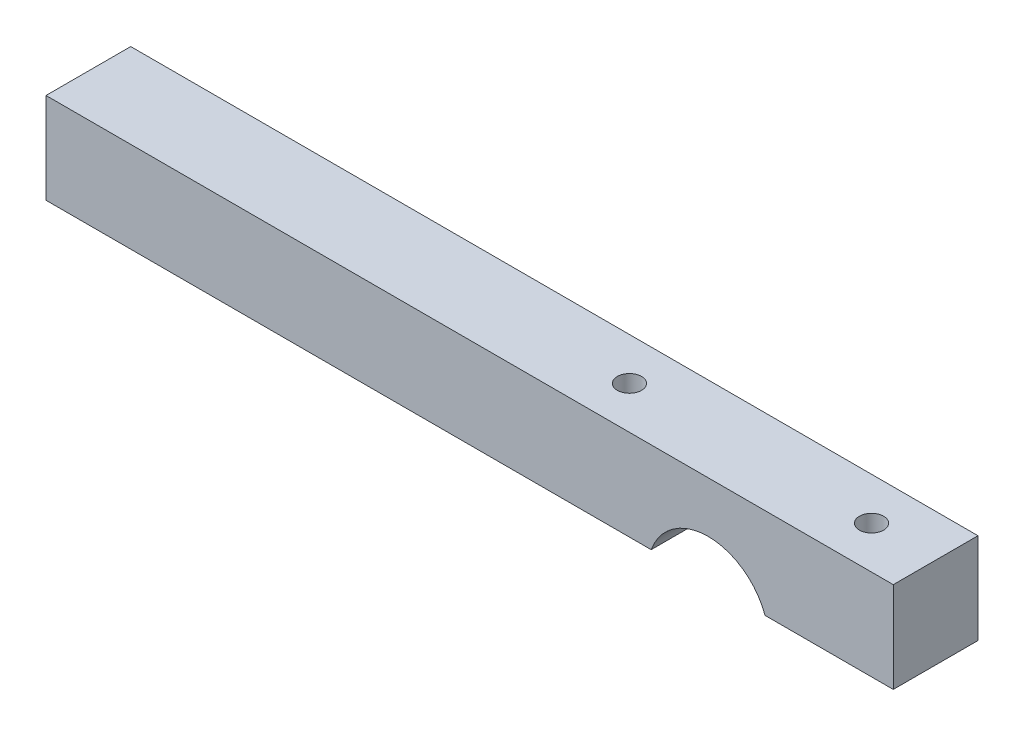
ISO-10303-21;
HEADER;
FILE_DESCRIPTION(('STEP AP214'),'2;1');
FILE_NAME('part.step','',(''),(''),'','','');
FILE_SCHEMA(('AUTOMOTIVE_DESIGN { 1 0 10303 214 1 1 1 1 }'));
ENDSEC;
DATA;
#1=APPLICATION_CONTEXT('core data for automotive mechanical design processes');
#2=APPLICATION_PROTOCOL_DEFINITION('international standard','automotive_design',2000,#1);
#3=PRODUCT_CONTEXT('',#1,'mechanical');
#4=PRODUCT('Part','Part','',(#3));
#5=PRODUCT_RELATED_PRODUCT_CATEGORY('part','',(#4));
#6=PRODUCT_DEFINITION_FORMATION('','',#4);
#7=PRODUCT_DEFINITION_CONTEXT('part definition',#1,'design');
#8=PRODUCT_DEFINITION('design','',#6,#7);
#9=PRODUCT_DEFINITION_SHAPE('','',#8);
#10=(LENGTH_UNIT() NAMED_UNIT(*) SI_UNIT(.MILLI.,.METRE.));
#11=(NAMED_UNIT(*) PLANE_ANGLE_UNIT() SI_UNIT($,.RADIAN.));
#12=(NAMED_UNIT(*) SI_UNIT($,.STERADIAN.) SOLID_ANGLE_UNIT());
#13=UNCERTAINTY_MEASURE_WITH_UNIT(LENGTH_MEASURE(1.E-05),#10,'distance_accuracy_value','');
#14=(GEOMETRIC_REPRESENTATION_CONTEXT(3) GLOBAL_UNCERTAINTY_ASSIGNED_CONTEXT((#13)) GLOBAL_UNIT_ASSIGNED_CONTEXT((#10,
#11,#12)) REPRESENTATION_CONTEXT('',''));
#15=CARTESIAN_POINT('',(0.,0.,0.));
#16=DIRECTION('',(0.,0.,1.));
#17=DIRECTION('',(1.,0.,0.));
#18=AXIS2_PLACEMENT_3D('',#15,#16,#17);
#19=CARTESIAN_POINT('',(-109.406636819133,18.3934029753232,14.));
#20=DIRECTION('',(1.,0.,0.));
#21=DIRECTION('',(0.,0.,-1.));
#22=AXIS2_PLACEMENT_3D('',#19,#20,#21);
#23=PLANE('',#22);
#24=DIRECTION('',(0.,-1.,0.));
#25=VECTOR('',#24,1.);
#26=CARTESIAN_POINT('',(-109.406636819133,18.3934029753232,0.));
#27=LINE('',#26,#25);
#28=CARTESIAN_POINT('',(-109.406636819133,18.3934029753232,0.));
#29=VERTEX_POINT('',#28);
#30=CARTESIAN_POINT('',(-109.406636819133,3.39340297532322,0.));
#31=VERTEX_POINT('',#30);
#32=EDGE_CURVE('E128',#29,#31,#27,.T.);
#33=ORIENTED_EDGE('',*,*,#32,.T.);
#34=DIRECTION('',(0.,0.,-1.));
#35=VECTOR('',#34,1.);
#36=CARTESIAN_POINT('',(-109.406636819133,3.39340297532322,14.));
#37=LINE('',#36,#35);
#38=CARTESIAN_POINT('',(-109.406636819133,3.39340297532322,14.));
#39=VERTEX_POINT('',#38);
#40=EDGE_CURVE('E11',#39,#31,#37,.T.);
#41=ORIENTED_EDGE('',*,*,#40,.F.);
#42=DIRECTION('',(0.,-1.,0.));
#43=VECTOR('',#42,1.);
#44=CARTESIAN_POINT('',(-109.406636819133,18.3934029753232,14.));
#45=LINE('',#44,#43);
#46=CARTESIAN_POINT('',(-109.406636819133,18.3934029753232,14.));
#47=VERTEX_POINT('',#46);
#48=EDGE_CURVE('E145',#47,#39,#45,.T.);
#49=ORIENTED_EDGE('',*,*,#48,.F.);
#50=DIRECTION('',(0.,0.,-1.));
#51=VECTOR('',#50,1.);
#52=CARTESIAN_POINT('',(-109.406636819133,18.3934029753232,14.));
#53=LINE('',#52,#51);
#54=EDGE_CURVE('E124',#47,#29,#53,.T.);
#55=ORIENTED_EDGE('',*,*,#54,.T.);
#56=EDGE_LOOP('',(#33,#41,#49,#55));
#57=FACE_BOUND('',#56,.T.);
#58=ADVANCED_FACE('F39',(#57),#23,.F.);
#59=CARTESIAN_POINT('',(-109.406636819133,3.39340297532322,14.));
#60=DIRECTION('',(0.,1.,0.));
#61=DIRECTION('',(-1.,0.,0.));
#62=AXIS2_PLACEMENT_3D('',#59,#60,#61);
#63=PLANE('',#62);
#64=CARTESIAN_POINT('',(-20.,3.39340297532322,7.));
#65=DIRECTION('',(0.,1.,0.));
#66=DIRECTION('',(-1.,0.,0.));
#67=AXIS2_PLACEMENT_3D('',#64,#65,#66);
#68=CIRCLE('',#67,2.);
#69=CARTESIAN_POINT('',(-22.,3.39340297532322,7.));
#70=VERTEX_POINT('',#69);
#71=EDGE_CURVE('E199',#70,#70,#68,.F.);
#72=ORIENTED_EDGE('',*,*,#71,.F.);
#73=EDGE_LOOP('',(#72));
#74=FACE_BOUND('',#73,.T.);
#75=DIRECTION('',(1.,0.,0.));
#76=VECTOR('',#75,1.);
#77=CARTESIAN_POINT('',(-109.406636819133,3.39340297532322,0.));
#78=LINE('',#77,#76);
#79=CARTESIAN_POINT('',(-9.40663681913294,3.39340297532322,0.));
#80=VERTEX_POINT('',#79);
#81=EDGE_CURVE('E132',#31,#80,#78,.T.);
#82=ORIENTED_EDGE('',*,*,#81,.T.);
#83=DIRECTION('',(0.,0.,-1.));
#84=VECTOR('',#83,1.);
#85=CARTESIAN_POINT('',(-9.40663681913294,3.39340297532322,14.));
#86=LINE('',#85,#84);
#87=CARTESIAN_POINT('',(-9.40663681913294,3.39340297532322,14.));
#88=VERTEX_POINT('',#87);
#89=EDGE_CURVE('E48',#88,#80,#86,.T.);
#90=ORIENTED_EDGE('',*,*,#89,.F.);
#91=DIRECTION('',(1.,0.,0.));
#92=VECTOR('',#91,1.);
#93=CARTESIAN_POINT('',(-109.406636819133,3.39340297532322,14.));
#94=LINE('',#93,#92);
#95=EDGE_CURVE('E93',#39,#88,#94,.T.);
#96=ORIENTED_EDGE('',*,*,#95,.F.);
#97=ORIENTED_EDGE('',*,*,#40,.T.);
#98=EDGE_LOOP('',(#82,#90,#96,#97));
#99=FACE_BOUND('',#98,.T.);
#100=ADVANCED_FACE('F176',(#74,#99),#63,.F.);
#101=CARTESIAN_POINT('',(0.,0.,14.));
#102=DIRECTION('',(0.,0.,-1.));
#103=DIRECTION('',(-1.,0.,0.));
#104=AXIS2_PLACEMENT_3D('',#101,#102,#103);
#105=CYLINDRICAL_SURFACE('',#104,10.);
#106=CARTESIAN_POINT('',(0.,0.,0.));
#107=DIRECTION('',(0.,0.,-1.));
#108=DIRECTION('',(-1.,0.,0.));
#109=AXIS2_PLACEMENT_3D('',#106,#107,#108);
#110=CIRCLE('',#109,10.);
#111=CARTESIAN_POINT('',(9.40663681913294,3.39340297532322,0.));
#112=VERTEX_POINT('',#111);
#113=EDGE_CURVE('E136',#80,#112,#110,.T.);
#114=ORIENTED_EDGE('',*,*,#113,.T.);
#115=DIRECTION('',(0.,0.,-1.));
#116=VECTOR('',#115,1.);
#117=CARTESIAN_POINT('',(9.40663681913294,3.39340297532322,14.));
#118=LINE('',#117,#116);
#119=CARTESIAN_POINT('',(9.40663681913294,3.39340297532322,14.));
#120=VERTEX_POINT('',#119);
#121=EDGE_CURVE('E117',#120,#112,#118,.T.);
#122=ORIENTED_EDGE('',*,*,#121,.F.);
#123=CARTESIAN_POINT('',(0.,0.,14.));
#124=DIRECTION('',(0.,0.,-1.));
#125=DIRECTION('',(-1.,0.,0.));
#126=AXIS2_PLACEMENT_3D('',#123,#124,#125);
#127=CIRCLE('',#126,10.);
#128=EDGE_CURVE('E106',#88,#120,#127,.T.);
#129=ORIENTED_EDGE('',*,*,#128,.F.);
#130=ORIENTED_EDGE('',*,*,#89,.T.);
#131=EDGE_LOOP('',(#114,#122,#129,#130));
#132=FACE_BOUND('',#131,.T.);
#133=ADVANCED_FACE('F155',(#132),#105,.F.);
#134=CARTESIAN_POINT('',(9.40663681913294,3.39340297532322,14.));
#135=DIRECTION('',(0.,1.,0.));
#136=DIRECTION('',(0.,0.,1.));
#137=AXIS2_PLACEMENT_3D('',#134,#135,#136);
#138=PLANE('',#137);
#139=CARTESIAN_POINT('',(20.,3.39340297532322,7.));
#140=DIRECTION('',(0.,1.,0.));
#141=DIRECTION('',(0.,0.,1.));
#142=AXIS2_PLACEMENT_3D('',#139,#140,#141);
#143=CIRCLE('',#142,2.);
#144=CARTESIAN_POINT('',(18.,3.39340297532322,7.));
#145=VERTEX_POINT('',#144);
#146=EDGE_CURVE('E133',#145,#145,#143,.F.);
#147=ORIENTED_EDGE('',*,*,#146,.F.);
#148=EDGE_LOOP('',(#147));
#149=FACE_BOUND('',#148,.T.);
#150=DIRECTION('',(1.,0.,0.));
#151=VECTOR('',#150,1.);
#152=CARTESIAN_POINT('',(9.40663681913294,3.39340297532322,0.));
#153=LINE('',#152,#151);
#154=CARTESIAN_POINT('',(30.5933631808671,3.39340297532322,0.));
#155=VERTEX_POINT('',#154);
#156=EDGE_CURVE('E115',#112,#155,#153,.T.);
#157=ORIENTED_EDGE('',*,*,#156,.T.);
#158=DIRECTION('',(0.,0.,-1.));
#159=VECTOR('',#158,1.);
#160=CARTESIAN_POINT('',(30.5933631808671,3.39340297532322,14.));
#161=LINE('',#160,#159);
#162=CARTESIAN_POINT('',(30.5933631808671,3.39340297532322,14.));
#163=VERTEX_POINT('',#162);
#164=EDGE_CURVE('E112',#163,#155,#161,.T.);
#165=ORIENTED_EDGE('',*,*,#164,.F.);
#166=DIRECTION('',(1.,0.,0.));
#167=VECTOR('',#166,1.);
#168=CARTESIAN_POINT('',(9.40663681913294,3.39340297532322,14.));
#169=LINE('',#168,#167);
#170=EDGE_CURVE('E100',#120,#163,#169,.T.);
#171=ORIENTED_EDGE('',*,*,#170,.F.);
#172=ORIENTED_EDGE('',*,*,#121,.T.);
#173=EDGE_LOOP('',(#157,#165,#171,#172));
#174=FACE_BOUND('',#173,.T.);
#175=ADVANCED_FACE('F113',(#149,#174),#138,.F.);
#176=CARTESIAN_POINT('',(30.5933631808671,18.3934029753232,14.));
#177=DIRECTION('',(-1.,0.,0.));
#178=DIRECTION('',(0.,-1.,0.));
#179=AXIS2_PLACEMENT_3D('',#176,#177,#178);
#180=PLANE('',#179);
#181=DIRECTION('',(0.,1.,0.));
#182=VECTOR('',#181,1.);
#183=CARTESIAN_POINT('',(30.5933631808671,18.3934029753232,0.));
#184=LINE('',#183,#182);
#185=CARTESIAN_POINT('',(30.5933631808671,18.3934029753232,0.));
#186=VERTEX_POINT('',#185);
#187=EDGE_CURVE('E79',#155,#186,#184,.T.);
#188=ORIENTED_EDGE('',*,*,#187,.T.);
#189=DIRECTION('',(0.,0.,-1.));
#190=VECTOR('',#189,1.);
#191=CARTESIAN_POINT('',(30.5933631808671,18.3934029753232,14.));
#192=LINE('',#191,#190);
#193=CARTESIAN_POINT('',(30.5933631808671,18.3934029753232,14.));
#194=VERTEX_POINT('',#193);
#195=EDGE_CURVE('E118',#194,#186,#192,.T.);
#196=ORIENTED_EDGE('',*,*,#195,.F.);
#197=DIRECTION('',(0.,1.,0.));
#198=VECTOR('',#197,1.);
#199=CARTESIAN_POINT('',(30.5933631808671,18.3934029753232,14.));
#200=LINE('',#199,#198);
#201=EDGE_CURVE('E104',#163,#194,#200,.T.);
#202=ORIENTED_EDGE('',*,*,#201,.F.);
#203=ORIENTED_EDGE('',*,*,#164,.T.);
#204=EDGE_LOOP('',(#188,#196,#202,#203));
#205=FACE_BOUND('',#204,.T.);
#206=ADVANCED_FACE('F120',(#205),#180,.F.);
#207=CARTESIAN_POINT('',(-109.406636819133,18.3934029753232,14.));
#208=DIRECTION('',(0.,-1.,0.));
#209=DIRECTION('',(1.,0.,0.));
#210=AXIS2_PLACEMENT_3D('',#207,#208,#209);
#211=PLANE('',#210);
#212=CARTESIAN_POINT('',(20.,18.3934029753232,7.));
#213=DIRECTION('',(0.,1.,0.));
#214=DIRECTION('',(-1.,0.,0.));
#215=AXIS2_PLACEMENT_3D('',#212,#213,#214);
#216=CIRCLE('',#215,2.);
#217=CARTESIAN_POINT('',(18.,18.3934029753232,7.));
#218=VERTEX_POINT('',#217);
#219=EDGE_CURVE('E195',#218,#218,#216,.T.);
#220=ORIENTED_EDGE('',*,*,#219,.F.);
#221=EDGE_LOOP('',(#220));
#222=FACE_BOUND('',#221,.T.);
#223=CARTESIAN_POINT('',(-20.,18.3934029753232,7.));
#224=DIRECTION('',(0.,1.,0.));
#225=DIRECTION('',(-1.,0.,0.));
#226=AXIS2_PLACEMENT_3D('',#223,#224,#225);
#227=CIRCLE('',#226,2.);
#228=CARTESIAN_POINT('',(-22.,18.3934029753232,7.));
#229=VERTEX_POINT('',#228);
#230=EDGE_CURVE('E202',#229,#229,#227,.T.);
#231=ORIENTED_EDGE('',*,*,#230,.F.);
#232=EDGE_LOOP('',(#231));
#233=FACE_BOUND('',#232,.T.);
#234=DIRECTION('',(-1.,0.,0.));
#235=VECTOR('',#234,1.);
#236=CARTESIAN_POINT('',(-109.406636819133,18.3934029753232,0.));
#237=LINE('',#236,#235);
#238=EDGE_CURVE('E85',#186,#29,#237,.T.);
#239=ORIENTED_EDGE('',*,*,#238,.T.);
#240=ORIENTED_EDGE('',*,*,#54,.F.);
#241=DIRECTION('',(-1.,0.,0.));
#242=VECTOR('',#241,1.);
#243=CARTESIAN_POINT('',(-109.406636819133,18.3934029753232,14.));
#244=LINE('',#243,#242);
#245=EDGE_CURVE('E56',#194,#47,#244,.T.);
#246=ORIENTED_EDGE('',*,*,#245,.F.);
#247=ORIENTED_EDGE('',*,*,#195,.T.);
#248=EDGE_LOOP('',(#239,#240,#246,#247));
#249=FACE_BOUND('',#248,.T.);
#250=ADVANCED_FACE('F162',(#222,#233,#249),#211,.F.);
#251=CARTESIAN_POINT('',(0.,0.,14.));
#252=DIRECTION('',(0.,0.,-1.));
#253=DIRECTION('',(-1.,0.,0.));
#254=AXIS2_PLACEMENT_3D('',#251,#252,#253);
#255=PLANE('',#254);
#256=ORIENTED_EDGE('',*,*,#48,.T.);
#257=ORIENTED_EDGE('',*,*,#95,.T.);
#258=ORIENTED_EDGE('',*,*,#128,.T.);
#259=ORIENTED_EDGE('',*,*,#170,.T.);
#260=ORIENTED_EDGE('',*,*,#201,.T.);
#261=ORIENTED_EDGE('',*,*,#245,.T.);
#262=EDGE_LOOP('',(#256,#257,#258,#259,#260,#261));
#263=FACE_BOUND('',#262,.T.);
#264=ADVANCED_FACE('F102',(#263),#255,.F.);
#265=CARTESIAN_POINT('',(0.,0.,0.));
#266=DIRECTION('',(0.,0.,-1.));
#267=DIRECTION('',(-1.,0.,0.));
#268=AXIS2_PLACEMENT_3D('',#265,#266,#267);
#269=PLANE('',#268);
#270=ORIENTED_EDGE('',*,*,#32,.F.);
#271=ORIENTED_EDGE('',*,*,#238,.F.);
#272=ORIENTED_EDGE('',*,*,#187,.F.);
#273=ORIENTED_EDGE('',*,*,#156,.F.);
#274=ORIENTED_EDGE('',*,*,#113,.F.);
#275=ORIENTED_EDGE('',*,*,#81,.F.);
#276=EDGE_LOOP('',(#270,#271,#272,#273,#274,#275));
#277=FACE_BOUND('',#276,.T.);
#278=ADVANCED_FACE('F158',(#277),#269,.T.);
#279=CARTESIAN_POINT('',(-20.,3.39240297532322,7.));
#280=DIRECTION('',(0.,1.,0.));
#281=DIRECTION('',(-1.,0.,0.));
#282=AXIS2_PLACEMENT_3D('',#279,#280,#281);
#283=CYLINDRICAL_SURFACE('',#282,2.);
#284=CARTESIAN_POINT('',(-22.,18.3934029753232,7.));
#285=CARTESIAN_POINT('',(-22.,18.2371529753232,7.));
#286=CARTESIAN_POINT('',(-22.,18.0809029753232,7.));
#287=CARTESIAN_POINT('',(-22.,17.7684029753232,7.));
#288=CARTESIAN_POINT('',(-22.,17.6121529753232,7.));
#289=CARTESIAN_POINT('',(-22.,17.2996529753232,7.));
#290=CARTESIAN_POINT('',(-22.,17.1434029753232,7.));
#291=CARTESIAN_POINT('',(-22.,16.8309029753232,7.));
#292=CARTESIAN_POINT('',(-22.,16.6746529753232,7.));
#293=CARTESIAN_POINT('',(-22.,16.3621529753232,7.));
#294=CARTESIAN_POINT('',(-22.,16.2059029753232,7.));
#295=CARTESIAN_POINT('',(-22.,15.8934029753232,7.));
#296=CARTESIAN_POINT('',(-22.,15.7371529753232,7.));
#297=CARTESIAN_POINT('',(-22.,15.4246529753232,7.));
#298=CARTESIAN_POINT('',(-22.,15.2684029753232,7.));
#299=CARTESIAN_POINT('',(-22.,14.9559029753232,7.));
#300=CARTESIAN_POINT('',(-22.,14.7996529753232,7.));
#301=CARTESIAN_POINT('',(-22.,14.4871529753232,7.));
#302=CARTESIAN_POINT('',(-22.,14.3309029753232,7.));
#303=CARTESIAN_POINT('',(-22.,14.0184029753232,7.));
#304=CARTESIAN_POINT('',(-22.,13.8621529753232,7.));
#305=CARTESIAN_POINT('',(-22.,13.5496529753232,7.));
#306=CARTESIAN_POINT('',(-22.,13.3934029753232,7.));
#307=CARTESIAN_POINT('',(-22.,13.0809029753232,7.));
#308=CARTESIAN_POINT('',(-22.,12.9246529753232,7.));
#309=CARTESIAN_POINT('',(-22.,12.6121529753232,7.));
#310=CARTESIAN_POINT('',(-22.,12.4559029753232,7.));
#311=CARTESIAN_POINT('',(-22.,12.1434029753232,7.));
#312=CARTESIAN_POINT('',(-22.,11.9871529753232,7.));
#313=CARTESIAN_POINT('',(-22.,11.6746529753232,7.));
#314=CARTESIAN_POINT('',(-22.,11.5184029753232,7.));
#315=CARTESIAN_POINT('',(-22.,11.2059029753232,7.));
#316=CARTESIAN_POINT('',(-22.,11.0496529753232,7.));
#317=CARTESIAN_POINT('',(-22.,10.7371529753232,7.));
#318=CARTESIAN_POINT('',(-22.,10.5809029753232,7.));
#319=CARTESIAN_POINT('',(-22.,10.2684029753232,7.));
#320=CARTESIAN_POINT('',(-22.,10.1121529753232,7.));
#321=CARTESIAN_POINT('',(-22.,9.79965297532322,7.));
#322=CARTESIAN_POINT('',(-22.,9.64340297532322,7.));
#323=CARTESIAN_POINT('',(-22.,9.33090297532322,7.));
#324=CARTESIAN_POINT('',(-22.,9.17465297532322,7.));
#325=CARTESIAN_POINT('',(-22.,8.86215297532322,7.));
#326=CARTESIAN_POINT('',(-22.,8.70590297532322,7.));
#327=CARTESIAN_POINT('',(-22.,8.39340297532322,7.));
#328=CARTESIAN_POINT('',(-22.,8.23715297532322,7.));
#329=CARTESIAN_POINT('',(-22.,7.92465297532322,7.));
#330=CARTESIAN_POINT('',(-22.,7.76840297532322,7.));
#331=CARTESIAN_POINT('',(-22.,7.45590297532322,7.));
#332=CARTESIAN_POINT('',(-22.,7.29965297532322,7.));
#333=CARTESIAN_POINT('',(-22.,6.98715297532322,7.));
#334=CARTESIAN_POINT('',(-22.,6.83090297532322,7.));
#335=CARTESIAN_POINT('',(-22.,6.51840297532322,7.));
#336=CARTESIAN_POINT('',(-22.,6.36215297532322,7.));
#337=CARTESIAN_POINT('',(-22.,6.04965297532322,7.));
#338=CARTESIAN_POINT('',(-22.,5.89340297532322,7.));
#339=CARTESIAN_POINT('',(-22.,5.58090297532322,7.));
#340=CARTESIAN_POINT('',(-22.,5.42465297532322,7.));
#341=CARTESIAN_POINT('',(-22.,5.11215297532322,7.));
#342=CARTESIAN_POINT('',(-22.,4.95590297532322,7.));
#343=CARTESIAN_POINT('',(-22.,4.64340297532322,7.));
#344=CARTESIAN_POINT('',(-22.,4.48715297532322,7.));
#345=CARTESIAN_POINT('',(-22.,4.17465297532322,7.));
#346=CARTESIAN_POINT('',(-22.,4.01840297532322,7.));
#347=CARTESIAN_POINT('',(-22.,3.70590297532322,7.));
#348=CARTESIAN_POINT('',(-22.,3.54965297532322,7.));
#349=CARTESIAN_POINT('',(-22.,3.39340297532322,7.));
#350=B_SPLINE_CURVE_WITH_KNOTS('',3,(#284,#285,#286,#287,#288,#289,#290,#291,#292,#293,#294,
#295,#296,#297,#298,#299,#300,#301,#302,#303,#304,#305,#306,#307,#308,#309,#310,#311,#312,#313,
#314,#315,#316,#317,#318,#319,#320,#321,#322,#323,#324,#325,#326,#327,#328,#329,#330,#331,#332,
#333,#334,#335,#336,#337,#338,#339,#340,#341,#342,#343,#344,#345,#346,#347,#348,#349),
.UNSPECIFIED.,.F.,.F.,(4,2,2,2,2,2,2,2,2,2,2,2,2,2,2,2,2,2,2,2,2,2,2,2,2,2,2,2,2,2,2,2,4),(0.,
0.46875,0.937500000000001,1.40625,1.875,2.34375,2.8125,3.28125,3.75,4.21875,4.6875,5.15625,
5.625,6.09375,6.5625,7.03125,7.5,7.96875,8.4375,8.90625,9.375,9.84375,10.3125,10.78125,11.25,
11.71875,12.1875,12.65625,13.125,13.59375,14.0625,14.53125,15.),.UNSPECIFIED.);
#351=EDGE_CURVE('BSEAM214',#229,#70,#350,.T.);
#352=ORIENTED_EDGE('',*,*,#230,.T.);
#353=ORIENTED_EDGE('',*,*,#71,.T.);
#354=ORIENTED_EDGE('',*,*,#351,.T.);
#355=ORIENTED_EDGE('',*,*,#351,.F.);
#356=EDGE_LOOP('',(#352,#354,#353,#355));
#357=FACE_BOUND('',#356,.T.);
#358=ADVANCED_FACE('F214',(#357),#283,.F.);
#359=CARTESIAN_POINT('',(20.,3.39240297532322,7.));
#360=DIRECTION('',(0.,1.,0.));
#361=DIRECTION('',(-1.,0.,0.));
#362=AXIS2_PLACEMENT_3D('',#359,#360,#361);
#363=CYLINDRICAL_SURFACE('',#362,2.);
#364=CARTESIAN_POINT('',(18.,18.3934029753232,7.));
#365=CARTESIAN_POINT('',(18.,18.2371529753232,7.));
#366=CARTESIAN_POINT('',(18.,18.0809029753232,7.));
#367=CARTESIAN_POINT('',(18.,17.7684029753232,7.));
#368=CARTESIAN_POINT('',(18.,17.6121529753232,7.));
#369=CARTESIAN_POINT('',(18.,17.2996529753232,7.));
#370=CARTESIAN_POINT('',(18.,17.1434029753232,7.));
#371=CARTESIAN_POINT('',(18.,16.8309029753232,7.));
#372=CARTESIAN_POINT('',(18.,16.6746529753232,7.));
#373=CARTESIAN_POINT('',(18.,16.3621529753232,7.));
#374=CARTESIAN_POINT('',(18.,16.2059029753232,7.));
#375=CARTESIAN_POINT('',(18.,15.8934029753232,7.));
#376=CARTESIAN_POINT('',(18.,15.7371529753232,7.));
#377=CARTESIAN_POINT('',(18.,15.4246529753232,7.));
#378=CARTESIAN_POINT('',(18.,15.2684029753232,7.));
#379=CARTESIAN_POINT('',(18.,14.9559029753232,7.));
#380=CARTESIAN_POINT('',(18.,14.7996529753232,7.));
#381=CARTESIAN_POINT('',(18.,14.4871529753232,7.));
#382=CARTESIAN_POINT('',(18.,14.3309029753232,7.));
#383=CARTESIAN_POINT('',(18.,14.0184029753232,7.));
#384=CARTESIAN_POINT('',(18.,13.8621529753232,7.));
#385=CARTESIAN_POINT('',(18.,13.5496529753232,7.));
#386=CARTESIAN_POINT('',(18.,13.3934029753232,7.));
#387=CARTESIAN_POINT('',(18.,13.0809029753232,7.));
#388=CARTESIAN_POINT('',(18.,12.9246529753232,7.));
#389=CARTESIAN_POINT('',(18.,12.6121529753232,7.));
#390=CARTESIAN_POINT('',(18.,12.4559029753232,7.));
#391=CARTESIAN_POINT('',(18.,12.1434029753232,7.));
#392=CARTESIAN_POINT('',(18.,11.9871529753232,7.));
#393=CARTESIAN_POINT('',(18.,11.6746529753232,7.));
#394=CARTESIAN_POINT('',(18.,11.5184029753232,7.));
#395=CARTESIAN_POINT('',(18.,11.2059029753232,7.));
#396=CARTESIAN_POINT('',(18.,11.0496529753232,7.));
#397=CARTESIAN_POINT('',(18.,10.7371529753232,7.));
#398=CARTESIAN_POINT('',(18.,10.5809029753232,7.));
#399=CARTESIAN_POINT('',(18.,10.2684029753232,7.));
#400=CARTESIAN_POINT('',(18.,10.1121529753232,7.));
#401=CARTESIAN_POINT('',(18.,9.79965297532322,7.));
#402=CARTESIAN_POINT('',(18.,9.64340297532322,7.));
#403=CARTESIAN_POINT('',(18.,9.33090297532322,7.));
#404=CARTESIAN_POINT('',(18.,9.17465297532322,7.));
#405=CARTESIAN_POINT('',(18.,8.86215297532322,7.));
#406=CARTESIAN_POINT('',(18.,8.70590297532322,7.));
#407=CARTESIAN_POINT('',(18.,8.39340297532322,7.));
#408=CARTESIAN_POINT('',(18.,8.23715297532322,7.));
#409=CARTESIAN_POINT('',(18.,7.92465297532322,7.));
#410=CARTESIAN_POINT('',(18.,7.76840297532322,7.));
#411=CARTESIAN_POINT('',(18.,7.45590297532322,7.));
#412=CARTESIAN_POINT('',(18.,7.29965297532322,7.));
#413=CARTESIAN_POINT('',(18.,6.98715297532322,7.));
#414=CARTESIAN_POINT('',(18.,6.83090297532322,7.));
#415=CARTESIAN_POINT('',(18.,6.51840297532322,7.));
#416=CARTESIAN_POINT('',(18.,6.36215297532322,7.));
#417=CARTESIAN_POINT('',(18.,6.04965297532322,7.));
#418=CARTESIAN_POINT('',(18.,5.89340297532322,7.));
#419=CARTESIAN_POINT('',(18.,5.58090297532322,7.));
#420=CARTESIAN_POINT('',(18.,5.42465297532322,7.));
#421=CARTESIAN_POINT('',(18.,5.11215297532322,7.));
#422=CARTESIAN_POINT('',(18.,4.95590297532322,7.));
#423=CARTESIAN_POINT('',(18.,4.64340297532322,7.));
#424=CARTESIAN_POINT('',(18.,4.48715297532322,7.));
#425=CARTESIAN_POINT('',(18.,4.17465297532322,7.));
#426=CARTESIAN_POINT('',(18.,4.01840297532322,7.));
#427=CARTESIAN_POINT('',(18.,3.70590297532322,7.));
#428=CARTESIAN_POINT('',(18.,3.54965297532322,7.));
#429=CARTESIAN_POINT('',(18.,3.39340297532322,7.));
#430=B_SPLINE_CURVE_WITH_KNOTS('',3,(#364,#365,#366,#367,#368,#369,#370,#371,#372,#373,#374,
#375,#376,#377,#378,#379,#380,#381,#382,#383,#384,#385,#386,#387,#388,#389,#390,#391,#392,#393,
#394,#395,#396,#397,#398,#399,#400,#401,#402,#403,#404,#405,#406,#407,#408,#409,#410,#411,#412,
#413,#414,#415,#416,#417,#418,#419,#420,#421,#422,#423,#424,#425,#426,#427,#428,#429),
.UNSPECIFIED.,.F.,.F.,(4,2,2,2,2,2,2,2,2,2,2,2,2,2,2,2,2,2,2,2,2,2,2,2,2,2,2,2,2,2,2,2,4),(0.,
0.46875,0.937500000000001,1.40625,1.875,2.34375,2.8125,3.28125,3.75,4.21875,4.6875,5.15625,
5.625,6.09375,6.5625,7.03125,7.5,7.96875,8.4375,8.90625,9.375,9.84375,10.3125,10.78125,11.25,
11.71875,12.1875,12.65625,13.125,13.59375,14.0625,14.53125,15.),.UNSPECIFIED.);
#431=EDGE_CURVE('BSEAM216',#218,#145,#430,.T.);
#432=ORIENTED_EDGE('',*,*,#219,.T.);
#433=ORIENTED_EDGE('',*,*,#146,.T.);
#434=ORIENTED_EDGE('',*,*,#431,.T.);
#435=ORIENTED_EDGE('',*,*,#431,.F.);
#436=EDGE_LOOP('',(#432,#434,#433,#435));
#437=FACE_BOUND('',#436,.T.);
#438=ADVANCED_FACE('F216',(#437),#363,.F.);
#439=CLOSED_SHELL('',(#58,#100,#133,#175,#206,#250,#264,#278,#358,#438));
#440=MANIFOLD_SOLID_BREP('B2',#439);
#441=ADVANCED_BREP_SHAPE_REPRESENTATION('',(#18,#440),#14);
#442=SHAPE_DEFINITION_REPRESENTATION(#9,#441);
ENDSEC;
END-ISO-10303-21;
